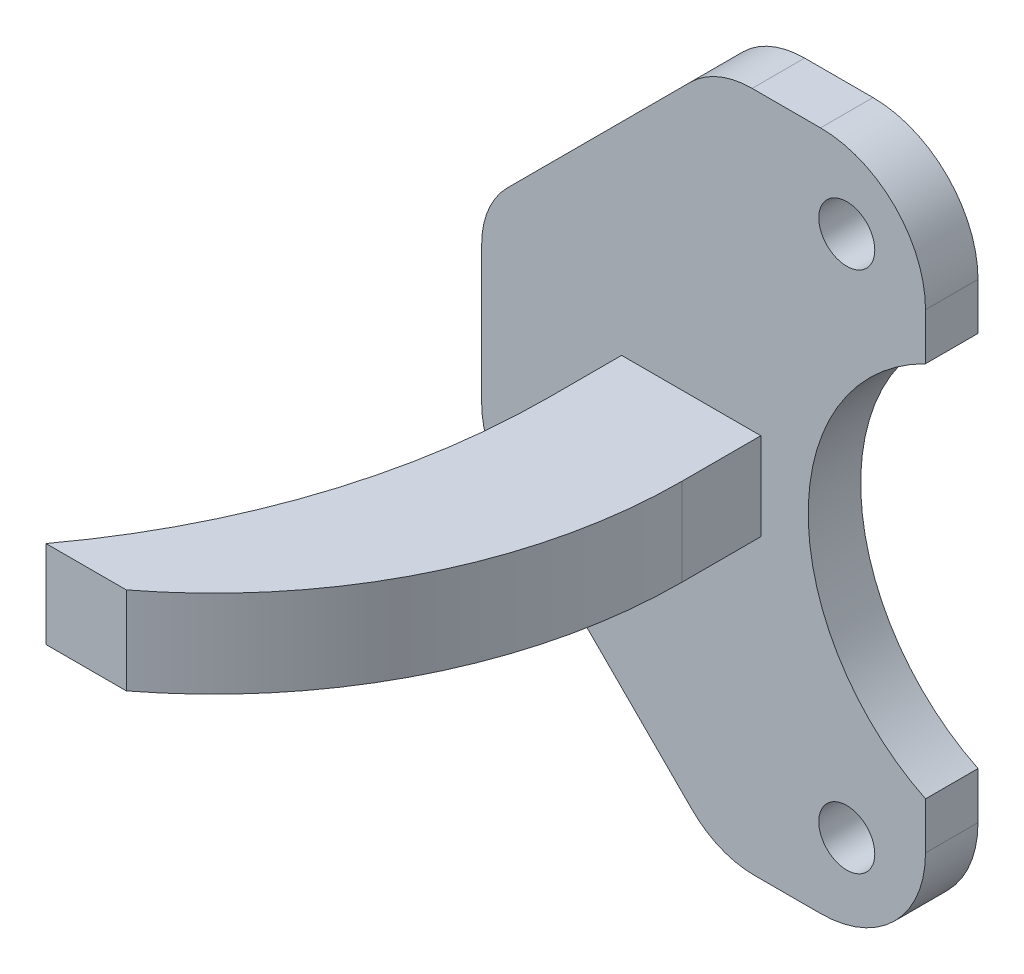
ISO-10303-21;
HEADER;
FILE_DESCRIPTION(('STEP AP214'),'2;1');
FILE_NAME('part.step','',(''),(''),'','','');
FILE_SCHEMA(('AUTOMOTIVE_DESIGN { 1 0 10303 214 1 1 1 1 }'));
ENDSEC;
DATA;
#1=APPLICATION_CONTEXT('core data for automotive mechanical design processes');
#2=APPLICATION_PROTOCOL_DEFINITION('international standard','automotive_design',2000,#1);
#3=PRODUCT_CONTEXT('',#1,'mechanical');
#4=PRODUCT('Part','Part','',(#3));
#5=PRODUCT_RELATED_PRODUCT_CATEGORY('part','',(#4));
#6=PRODUCT_DEFINITION_FORMATION('','',#4);
#7=PRODUCT_DEFINITION_CONTEXT('part definition',#1,'design');
#8=PRODUCT_DEFINITION('design','',#6,#7);
#9=PRODUCT_DEFINITION_SHAPE('','',#8);
#10=(LENGTH_UNIT() NAMED_UNIT(*) SI_UNIT(.MILLI.,.METRE.));
#11=(NAMED_UNIT(*) PLANE_ANGLE_UNIT() SI_UNIT($,.RADIAN.));
#12=(NAMED_UNIT(*) SI_UNIT($,.STERADIAN.) SOLID_ANGLE_UNIT());
#13=UNCERTAINTY_MEASURE_WITH_UNIT(LENGTH_MEASURE(1.E-05),#10,'distance_accuracy_value','');
#14=(GEOMETRIC_REPRESENTATION_CONTEXT(3) GLOBAL_UNCERTAINTY_ASSIGNED_CONTEXT((#13)) GLOBAL_UNIT_ASSIGNED_CONTEXT((#10,
#11,#12)) REPRESENTATION_CONTEXT('',''));
#15=CARTESIAN_POINT('',(0.,0.,0.));
#16=DIRECTION('',(0.,0.,1.));
#17=DIRECTION('',(1.,0.,0.));
#18=AXIS2_PLACEMENT_3D('',#15,#16,#17);
#19=CARTESIAN_POINT('',(35.5,-13.4440869692849,3.));
#20=DIRECTION('',(0.,0.,-1.));
#21=DIRECTION('',(-1.,0.,0.));
#22=AXIS2_PLACEMENT_3D('',#19,#20,#21);
#23=PLANE('',#22);
#24=CARTESIAN_POINT('',(37.,-14.9440869692848,3.));
#25=DIRECTION('',(0.,0.,1.));
#26=DIRECTION('',(1.,0.,0.));
#27=AXIS2_PLACEMENT_3D('',#24,#25,#26);
#28=CIRCLE('',#27,1.6);
#29=CARTESIAN_POINT('',(38.6,-14.9440869692848,3.));
#30=VERTEX_POINT('',#29);
#31=EDGE_CURVE('E291',#30,#30,#28,.T.);
#32=ORIENTED_EDGE('',*,*,#31,.F.);
#33=EDGE_LOOP('',(#32));
#34=FACE_BOUND('',#33,.T.);
#35=CARTESIAN_POINT('',(37.,14.9440869692848,3.));
#36=DIRECTION('',(0.,0.,1.));
#37=DIRECTION('',(1.,0.,0.));
#38=AXIS2_PLACEMENT_3D('',#35,#36,#37);
#39=CIRCLE('',#38,1.6);
#40=CARTESIAN_POINT('',(38.6,14.9440869692848,3.));
#41=VERTEX_POINT('',#40);
#42=EDGE_CURVE('E182',#41,#41,#39,.T.);
#43=ORIENTED_EDGE('',*,*,#42,.F.);
#44=EDGE_LOOP('',(#43));
#45=FACE_BOUND('',#44,.T.);
#46=CARTESIAN_POINT('',(35.5,-13.4440869692849,3.));
#47=DIRECTION('',(0.,0.,1.));
#48=DIRECTION('',(-1.,0.,0.));
#49=AXIS2_PLACEMENT_3D('',#46,#47,#48);
#50=CIRCLE('',#49,6.);
#51=CARTESIAN_POINT('',(35.5,-19.4440869692849,3.));
#52=VERTEX_POINT('',#51);
#53=CARTESIAN_POINT('',(41.5,-13.4440869692848,3.));
#54=VERTEX_POINT('',#53);
#55=EDGE_CURVE('E206',#52,#54,#50,.T.);
#56=ORIENTED_EDGE('',*,*,#55,.T.);
#57=DIRECTION('',(0.,1.,0.));
#58=VECTOR('',#57,1.);
#59=CARTESIAN_POINT('',(41.5,-10.7682017290115,3.));
#60=LINE('',#59,#58);
#61=CARTESIAN_POINT('',(41.5,-10.7682017290115,3.));
#62=VERTEX_POINT('',#61);
#63=EDGE_CURVE('E116',#54,#62,#60,.T.);
#64=ORIENTED_EDGE('',*,*,#63,.T.);
#65=CARTESIAN_POINT('',(46.7958315233127,0.,3.));
#66=DIRECTION('',(0.,0.,-1.));
#67=DIRECTION('',(1.,0.,0.));
#68=AXIS2_PLACEMENT_3D('',#65,#66,#67);
#69=CIRCLE('',#68,12.);
#70=CARTESIAN_POINT('',(41.5,10.7682017290116,3.));
#71=VERTEX_POINT('',#70);
#72=EDGE_CURVE('E239',#62,#71,#69,.T.);
#73=ORIENTED_EDGE('',*,*,#72,.T.);
#74=DIRECTION('',(0.,1.,0.));
#75=VECTOR('',#74,1.);
#76=CARTESIAN_POINT('',(41.5,13.4440869692848,3.));
#77=LINE('',#76,#75);
#78=CARTESIAN_POINT('',(41.5,13.4440869692848,3.));
#79=VERTEX_POINT('',#78);
#80=EDGE_CURVE('E258',#71,#79,#77,.T.);
#81=ORIENTED_EDGE('',*,*,#80,.T.);
#82=CARTESIAN_POINT('',(35.5,13.4440869692848,3.));
#83=DIRECTION('',(0.,0.,1.));
#84=DIRECTION('',(-1.,0.,0.));
#85=AXIS2_PLACEMENT_3D('',#82,#83,#84);
#86=CIRCLE('',#85,6.);
#87=CARTESIAN_POINT('',(35.5,19.4440869692848,3.));
#88=VERTEX_POINT('',#87);
#89=EDGE_CURVE('E255',#79,#88,#86,.T.);
#90=ORIENTED_EDGE('',*,*,#89,.T.);
#91=DIRECTION('',(-1.,0.,0.));
#92=VECTOR('',#91,1.);
#93=CARTESIAN_POINT('',(35.5,19.4440869692848,3.));
#94=LINE('',#93,#92);
#95=CARTESIAN_POINT('',(31.5921904216826,19.4440869692848,3.));
#96=VERTEX_POINT('',#95);
#97=EDGE_CURVE('E257',#88,#96,#94,.T.);
#98=ORIENTED_EDGE('',*,*,#97,.T.);
#99=CARTESIAN_POINT('',(31.5921904216826,14.4440869692848,3.));
#100=DIRECTION('',(0.,0.,1.));
#101=DIRECTION('',(-1.,0.,0.));
#102=AXIS2_PLACEMENT_3D('',#99,#100,#101);
#103=CIRCLE('',#102,5.);
#104=CARTESIAN_POINT('',(28.0566565157499,17.9796208752176,3.));
#105=VERTEX_POINT('',#104);
#106=EDGE_CURVE('E260',#96,#105,#103,.T.);
#107=ORIENTED_EDGE('',*,*,#106,.T.);
#108=DIRECTION('',(-0.707106781186546,-0.707106781186549,0.));
#109=VECTOR('',#108,1.);
#110=CARTESIAN_POINT('',(28.0566565157499,17.9796208752176,3.));
#111=LINE('',#110,#109);
#112=CARTESIAN_POINT('',(17.5972426377296,7.52020699719729,3.));
#113=VERTEX_POINT('',#112);
#114=EDGE_CURVE('E266',#105,#113,#111,.T.);
#115=ORIENTED_EDGE('',*,*,#114,.T.);
#116=CARTESIAN_POINT('',(21.1327765436624,3.98467309126455,3.));
#117=DIRECTION('',(0.,0.,1.));
#118=DIRECTION('',(1.,0.,0.));
#119=AXIS2_PLACEMENT_3D('',#116,#117,#118);
#120=CIRCLE('',#119,5.);
#121=CARTESIAN_POINT('',(16.1327765436624,3.98467309126456,3.));
#122=VERTEX_POINT('',#121);
#123=EDGE_CURVE('E268',#113,#122,#120,.T.);
#124=ORIENTED_EDGE('',*,*,#123,.T.);
#125=DIRECTION('',(0.,-1.,0.));
#126=VECTOR('',#125,1.);
#127=CARTESIAN_POINT('',(16.1327765436624,3.98467309126456,3.));
#128=LINE('',#127,#126);
#129=CARTESIAN_POINT('',(16.1327765436624,-3.87319128500447,3.));
#130=VERTEX_POINT('',#129);
#131=EDGE_CURVE('E270',#122,#130,#128,.T.);
#132=ORIENTED_EDGE('',*,*,#131,.T.);
#133=CARTESIAN_POINT('',(21.1327765436624,-3.87319128500449,3.));
#134=DIRECTION('',(0.,0.,1.));
#135=DIRECTION('',(1.,0.,0.));
#136=AXIS2_PLACEMENT_3D('',#133,#134,#135);
#137=CIRCLE('',#136,5.);
#138=CARTESIAN_POINT('',(17.5972426377296,-7.40872519093724,3.));
#139=VERTEX_POINT('',#138);
#140=EDGE_CURVE('E157',#130,#139,#137,.T.);
#141=ORIENTED_EDGE('',*,*,#140,.T.);
#142=DIRECTION('',(0.707106781186552,-0.707106781186544,0.));
#143=VECTOR('',#142,1.);
#144=CARTESIAN_POINT('',(17.5972426377296,-7.40872519093724,3.));
#145=LINE('',#144,#143);
#146=CARTESIAN_POINT('',(28.1681383220101,-17.9796208752176,3.));
#147=VERTEX_POINT('',#146);
#148=EDGE_CURVE('E150',#139,#147,#145,.T.);
#149=ORIENTED_EDGE('',*,*,#148,.T.);
#150=CARTESIAN_POINT('',(31.7036722279428,-14.4440869692849,3.));
#151=DIRECTION('',(0.,0.,1.));
#152=DIRECTION('',(1.,0.,0.));
#153=AXIS2_PLACEMENT_3D('',#150,#151,#152);
#154=CIRCLE('',#153,5.);
#155=CARTESIAN_POINT('',(31.7036722279428,-19.4440869692848,3.));
#156=VERTEX_POINT('',#155);
#157=EDGE_CURVE('E154',#147,#156,#154,.T.);
#158=ORIENTED_EDGE('',*,*,#157,.T.);
#159=DIRECTION('',(1.,0.,0.));
#160=VECTOR('',#159,1.);
#161=CARTESIAN_POINT('',(35.5,-19.4440869692849,3.));
#162=LINE('',#161,#160);
#163=EDGE_CURVE('E57',#156,#52,#162,.T.);
#164=ORIENTED_EDGE('',*,*,#163,.T.);
#165=EDGE_LOOP('',(#56,#64,#73,#81,#90,#98,#107,#115,#124,#132,#141,#149,#158,#164));
#166=FACE_BOUND('',#165,.T.);
#167=DIRECTION('',(-1.,0.,0.));
#168=VECTOR('',#167,1.);
#169=CARTESIAN_POINT('',(24.1327765436624,2.5,3.));
#170=LINE('',#169,#168);
#171=CARTESIAN_POINT('',(32.0857556598747,2.5,3.));
#172=VERTEX_POINT('',#171);
#173=CARTESIAN_POINT('',(24.1327765436624,2.5,3.));
#174=VERTEX_POINT('',#173);
#175=EDGE_CURVE('E319',#172,#174,#170,.T.);
#176=ORIENTED_EDGE('',*,*,#175,.F.);
#177=DIRECTION('',(0.,-1.,0.));
#178=VECTOR('',#177,1.);
#179=CARTESIAN_POINT('',(32.0857556598747,2.5,3.));
#180=LINE('',#179,#178);
#181=CARTESIAN_POINT('',(32.0857556598747,-2.5,3.));
#182=VERTEX_POINT('',#181);
#183=EDGE_CURVE('E312',#172,#182,#180,.T.);
#184=ORIENTED_EDGE('',*,*,#183,.T.);
#185=DIRECTION('',(-1.,0.,0.));
#186=VECTOR('',#185,1.);
#187=CARTESIAN_POINT('',(24.1327765436624,-2.5,3.));
#188=LINE('',#187,#186);
#189=CARTESIAN_POINT('',(24.1327765436624,-2.5,3.));
#190=VERTEX_POINT('',#189);
#191=EDGE_CURVE('E331',#182,#190,#188,.T.);
#192=ORIENTED_EDGE('',*,*,#191,.T.);
#193=DIRECTION('',(0.,-1.,0.));
#194=VECTOR('',#193,1.);
#195=CARTESIAN_POINT('',(24.1327765436624,2.5,3.));
#196=LINE('',#195,#194);
#197=EDGE_CURVE('E48',#174,#190,#196,.T.);
#198=ORIENTED_EDGE('',*,*,#197,.F.);
#199=EDGE_LOOP('',(#176,#184,#192,#198));
#200=FACE_BOUND('',#199,.T.);
#201=ADVANCED_FACE('F33',(#34,#45,#166,#200),#23,.F.);
#202=CARTESIAN_POINT('',(35.5,-13.4440869692849,0.));
#203=DIRECTION('',(0.,0.,-1.));
#204=DIRECTION('',(-1.,0.,0.));
#205=AXIS2_PLACEMENT_3D('',#202,#203,#204);
#206=PLANE('',#205);
#207=CARTESIAN_POINT('',(37.,14.9440869692848,0.));
#208=DIRECTION('',(0.,0.,1.));
#209=DIRECTION('',(1.,0.,0.));
#210=AXIS2_PLACEMENT_3D('',#207,#208,#209);
#211=CIRCLE('',#210,1.6);
#212=CARTESIAN_POINT('',(38.6,14.9440869692848,0.));
#213=VERTEX_POINT('',#212);
#214=EDGE_CURVE('E288',#213,#213,#211,.T.);
#215=ORIENTED_EDGE('',*,*,#214,.T.);
#216=EDGE_LOOP('',(#215));
#217=FACE_BOUND('',#216,.T.);
#218=CARTESIAN_POINT('',(35.5,-13.4440869692849,0.));
#219=DIRECTION('',(0.,0.,1.));
#220=DIRECTION('',(-1.,0.,0.));
#221=AXIS2_PLACEMENT_3D('',#218,#219,#220);
#222=CIRCLE('',#221,6.);
#223=CARTESIAN_POINT('',(35.5,-19.4440869692849,0.));
#224=VERTEX_POINT('',#223);
#225=CARTESIAN_POINT('',(41.5,-13.4440869692848,0.));
#226=VERTEX_POINT('',#225);
#227=EDGE_CURVE('E178',#224,#226,#222,.T.);
#228=ORIENTED_EDGE('',*,*,#227,.F.);
#229=DIRECTION('',(1.,0.,0.));
#230=VECTOR('',#229,1.);
#231=CARTESIAN_POINT('',(35.5,-19.4440869692849,0.));
#232=LINE('',#231,#230);
#233=CARTESIAN_POINT('',(31.7036722279428,-19.4440869692848,0.));
#234=VERTEX_POINT('',#233);
#235=EDGE_CURVE('E108',#234,#224,#232,.T.);
#236=ORIENTED_EDGE('',*,*,#235,.F.);
#237=CARTESIAN_POINT('',(31.7036722279428,-14.4440869692849,0.));
#238=DIRECTION('',(0.,0.,1.));
#239=DIRECTION('',(1.,0.,0.));
#240=AXIS2_PLACEMENT_3D('',#237,#238,#239);
#241=CIRCLE('',#240,5.);
#242=CARTESIAN_POINT('',(28.1681383220101,-17.9796208752176,0.));
#243=VERTEX_POINT('',#242);
#244=EDGE_CURVE('E203',#243,#234,#241,.T.);
#245=ORIENTED_EDGE('',*,*,#244,.F.);
#246=DIRECTION('',(0.707106781186552,-0.707106781186544,0.));
#247=VECTOR('',#246,1.);
#248=CARTESIAN_POINT('',(17.5972426377296,-7.40872519093724,0.));
#249=LINE('',#248,#247);
#250=CARTESIAN_POINT('',(17.5972426377296,-7.40872519093724,0.));
#251=VERTEX_POINT('',#250);
#252=EDGE_CURVE('E166',#251,#243,#249,.T.);
#253=ORIENTED_EDGE('',*,*,#252,.F.);
#254=CARTESIAN_POINT('',(21.1327765436624,-3.87319128500449,0.));
#255=DIRECTION('',(0.,0.,1.));
#256=DIRECTION('',(1.,0.,0.));
#257=AXIS2_PLACEMENT_3D('',#254,#255,#256);
#258=CIRCLE('',#257,5.);
#259=CARTESIAN_POINT('',(16.1327765436624,-3.87319128500447,0.));
#260=VERTEX_POINT('',#259);
#261=EDGE_CURVE('E200',#260,#251,#258,.T.);
#262=ORIENTED_EDGE('',*,*,#261,.F.);
#263=DIRECTION('',(0.,-1.,0.));
#264=VECTOR('',#263,1.);
#265=CARTESIAN_POINT('',(16.1327765436624,3.98467309126456,0.));
#266=LINE('',#265,#264);
#267=CARTESIAN_POINT('',(16.1327765436624,3.98467309126456,0.));
#268=VERTEX_POINT('',#267);
#269=EDGE_CURVE('E198',#268,#260,#266,.T.);
#270=ORIENTED_EDGE('',*,*,#269,.F.);
#271=CARTESIAN_POINT('',(21.1327765436624,3.98467309126455,0.));
#272=DIRECTION('',(0.,0.,1.));
#273=DIRECTION('',(1.,0.,0.));
#274=AXIS2_PLACEMENT_3D('',#271,#272,#273);
#275=CIRCLE('',#274,5.);
#276=CARTESIAN_POINT('',(17.5972426377296,7.52020699719729,0.));
#277=VERTEX_POINT('',#276);
#278=EDGE_CURVE('E196',#277,#268,#275,.T.);
#279=ORIENTED_EDGE('',*,*,#278,.F.);
#280=DIRECTION('',(-0.707106781186546,-0.707106781186549,0.));
#281=VECTOR('',#280,1.);
#282=CARTESIAN_POINT('',(28.0566565157499,17.9796208752176,0.));
#283=LINE('',#282,#281);
#284=CARTESIAN_POINT('',(28.0566565157499,17.9796208752176,0.));
#285=VERTEX_POINT('',#284);
#286=EDGE_CURVE('E194',#285,#277,#283,.T.);
#287=ORIENTED_EDGE('',*,*,#286,.F.);
#288=CARTESIAN_POINT('',(31.5921904216826,14.4440869692848,0.));
#289=DIRECTION('',(0.,0.,1.));
#290=DIRECTION('',(-1.,0.,0.));
#291=AXIS2_PLACEMENT_3D('',#288,#289,#290);
#292=CIRCLE('',#291,5.);
#293=CARTESIAN_POINT('',(31.5921904216826,19.4440869692848,0.));
#294=VERTEX_POINT('',#293);
#295=EDGE_CURVE('E192',#294,#285,#292,.T.);
#296=ORIENTED_EDGE('',*,*,#295,.F.);
#297=DIRECTION('',(-1.,0.,0.));
#298=VECTOR('',#297,1.);
#299=CARTESIAN_POINT('',(35.5,19.4440869692848,0.));
#300=LINE('',#299,#298);
#301=CARTESIAN_POINT('',(35.5,19.4440869692848,0.));
#302=VERTEX_POINT('',#301);
#303=EDGE_CURVE('E190',#302,#294,#300,.T.);
#304=ORIENTED_EDGE('',*,*,#303,.F.);
#305=CARTESIAN_POINT('',(35.5,13.4440869692848,0.));
#306=DIRECTION('',(0.,0.,1.));
#307=DIRECTION('',(-1.,0.,0.));
#308=AXIS2_PLACEMENT_3D('',#305,#306,#307);
#309=CIRCLE('',#308,6.);
#310=CARTESIAN_POINT('',(41.5,13.4440869692848,0.));
#311=VERTEX_POINT('',#310);
#312=EDGE_CURVE('E188',#311,#302,#309,.T.);
#313=ORIENTED_EDGE('',*,*,#312,.F.);
#314=DIRECTION('',(0.,1.,0.));
#315=VECTOR('',#314,1.);
#316=CARTESIAN_POINT('',(41.5,13.4440869692848,0.));
#317=LINE('',#316,#315);
#318=CARTESIAN_POINT('',(41.5,10.7682017290116,0.));
#319=VERTEX_POINT('',#318);
#320=EDGE_CURVE('E186',#319,#311,#317,.T.);
#321=ORIENTED_EDGE('',*,*,#320,.F.);
#322=CARTESIAN_POINT('',(46.7958315233127,0.,0.));
#323=DIRECTION('',(0.,0.,-1.));
#324=DIRECTION('',(1.,0.,0.));
#325=AXIS2_PLACEMENT_3D('',#322,#323,#324);
#326=CIRCLE('',#325,12.);
#327=CARTESIAN_POINT('',(41.5,-10.7682017290115,0.));
#328=VERTEX_POINT('',#327);
#329=EDGE_CURVE('E184',#328,#319,#326,.T.);
#330=ORIENTED_EDGE('',*,*,#329,.F.);
#331=DIRECTION('',(0.,1.,0.));
#332=VECTOR('',#331,1.);
#333=CARTESIAN_POINT('',(41.5,-10.7682017290115,0.));
#334=LINE('',#333,#332);
#335=EDGE_CURVE('E181',#226,#328,#334,.T.);
#336=ORIENTED_EDGE('',*,*,#335,.F.);
#337=EDGE_LOOP('',(#228,#236,#245,#253,#262,#270,#279,#287,#296,#304,#313,#321,#330,#336));
#338=FACE_BOUND('',#337,.T.);
#339=CARTESIAN_POINT('',(37.,-14.9440869692848,0.));
#340=DIRECTION('',(0.,0.,1.));
#341=DIRECTION('',(1.,0.,0.));
#342=AXIS2_PLACEMENT_3D('',#339,#340,#341);
#343=CIRCLE('',#342,1.6);
#344=CARTESIAN_POINT('',(38.6,-14.9440869692848,0.));
#345=VERTEX_POINT('',#344);
#346=EDGE_CURVE('E294',#345,#345,#343,.T.);
#347=ORIENTED_EDGE('',*,*,#346,.T.);
#348=EDGE_LOOP('',(#347));
#349=FACE_BOUND('',#348,.T.);
#350=ADVANCED_FACE('F243',(#217,#338,#349),#206,.T.);
#351=CARTESIAN_POINT('',(35.5,-13.4440869692849,3.));
#352=DIRECTION('',(0.,0.,-1.));
#353=DIRECTION('',(-1.,0.,0.));
#354=AXIS2_PLACEMENT_3D('',#351,#352,#353);
#355=CYLINDRICAL_SURFACE('',#354,6.);
#356=ORIENTED_EDGE('',*,*,#227,.T.);
#357=DIRECTION('',(0.,0.,-1.));
#358=VECTOR('',#357,1.);
#359=CARTESIAN_POINT('',(41.5,-13.4440869692848,3.));
#360=LINE('',#359,#358);
#361=EDGE_CURVE('E11',#54,#226,#360,.T.);
#362=ORIENTED_EDGE('',*,*,#361,.F.);
#363=ORIENTED_EDGE('',*,*,#55,.F.);
#364=DIRECTION('',(0.,0.,-1.));
#365=VECTOR('',#364,1.);
#366=CARTESIAN_POINT('',(35.5,-19.4440869692849,3.));
#367=LINE('',#366,#365);
#368=EDGE_CURVE('E174',#52,#224,#367,.T.);
#369=ORIENTED_EDGE('',*,*,#368,.T.);
#370=EDGE_LOOP('',(#356,#362,#363,#369));
#371=FACE_BOUND('',#370,.T.);
#372=ADVANCED_FACE('F35',(#371),#355,.T.);
#373=CARTESIAN_POINT('',(41.5,-10.7682017290115,3.));
#374=DIRECTION('',(-1.,0.,0.));
#375=DIRECTION('',(0.,0.,1.));
#376=AXIS2_PLACEMENT_3D('',#373,#374,#375);
#377=PLANE('',#376);
#378=ORIENTED_EDGE('',*,*,#335,.T.);
#379=DIRECTION('',(0.,0.,-1.));
#380=VECTOR('',#379,1.);
#381=CARTESIAN_POINT('',(41.5,-10.7682017290115,3.));
#382=LINE('',#381,#380);
#383=EDGE_CURVE('E41',#62,#328,#382,.T.);
#384=ORIENTED_EDGE('',*,*,#383,.F.);
#385=ORIENTED_EDGE('',*,*,#63,.F.);
#386=ORIENTED_EDGE('',*,*,#361,.T.);
#387=EDGE_LOOP('',(#378,#384,#385,#386));
#388=FACE_BOUND('',#387,.T.);
#389=ADVANCED_FACE('F448',(#388),#377,.F.);
#390=CARTESIAN_POINT('',(46.7958315233127,0.,3.));
#391=DIRECTION('',(0.,0.,-1.));
#392=DIRECTION('',(-1.,0.,0.));
#393=AXIS2_PLACEMENT_3D('',#390,#391,#392);
#394=CYLINDRICAL_SURFACE('',#393,12.);
#395=ORIENTED_EDGE('',*,*,#329,.T.);
#396=DIRECTION('',(0.,0.,-1.));
#397=VECTOR('',#396,1.);
#398=CARTESIAN_POINT('',(41.5,10.7682017290116,3.));
#399=LINE('',#398,#397);
#400=EDGE_CURVE('E231',#71,#319,#399,.T.);
#401=ORIENTED_EDGE('',*,*,#400,.F.);
#402=ORIENTED_EDGE('',*,*,#72,.F.);
#403=ORIENTED_EDGE('',*,*,#383,.T.);
#404=EDGE_LOOP('',(#395,#401,#402,#403));
#405=FACE_BOUND('',#404,.T.);
#406=ADVANCED_FACE('F237',(#405),#394,.F.);
#407=CARTESIAN_POINT('',(41.5,13.4440869692848,3.));
#408=DIRECTION('',(-1.,0.,0.));
#409=DIRECTION('',(0.,0.,1.));
#410=AXIS2_PLACEMENT_3D('',#407,#408,#409);
#411=PLANE('',#410);
#412=ORIENTED_EDGE('',*,*,#320,.T.);
#413=DIRECTION('',(0.,0.,-1.));
#414=VECTOR('',#413,1.);
#415=CARTESIAN_POINT('',(41.5,13.4440869692848,3.));
#416=LINE('',#415,#414);
#417=EDGE_CURVE('E228',#79,#311,#416,.T.);
#418=ORIENTED_EDGE('',*,*,#417,.F.);
#419=ORIENTED_EDGE('',*,*,#80,.F.);
#420=ORIENTED_EDGE('',*,*,#400,.T.);
#421=EDGE_LOOP('',(#412,#418,#419,#420));
#422=FACE_BOUND('',#421,.T.);
#423=ADVANCED_FACE('F249',(#422),#411,.F.);
#424=CARTESIAN_POINT('',(35.5,13.4440869692848,3.));
#425=DIRECTION('',(0.,0.,-1.));
#426=DIRECTION('',(-1.,0.,0.));
#427=AXIS2_PLACEMENT_3D('',#424,#425,#426);
#428=CYLINDRICAL_SURFACE('',#427,6.);
#429=ORIENTED_EDGE('',*,*,#312,.T.);
#430=DIRECTION('',(0.,0.,-1.));
#431=VECTOR('',#430,1.);
#432=CARTESIAN_POINT('',(35.5,19.4440869692848,3.));
#433=LINE('',#432,#431);
#434=EDGE_CURVE('E225',#88,#302,#433,.T.);
#435=ORIENTED_EDGE('',*,*,#434,.F.);
#436=ORIENTED_EDGE('',*,*,#89,.F.);
#437=ORIENTED_EDGE('',*,*,#417,.T.);
#438=EDGE_LOOP('',(#429,#435,#436,#437));
#439=FACE_BOUND('',#438,.T.);
#440=ADVANCED_FACE('F253',(#439),#428,.T.);
#441=CARTESIAN_POINT('',(35.5,19.4440869692848,3.));
#442=DIRECTION('',(0.,-1.,0.));
#443=DIRECTION('',(1.,0.,0.));
#444=AXIS2_PLACEMENT_3D('',#441,#442,#443);
#445=PLANE('',#444);
#446=ORIENTED_EDGE('',*,*,#303,.T.);
#447=DIRECTION('',(0.,0.,-1.));
#448=VECTOR('',#447,1.);
#449=CARTESIAN_POINT('',(31.5921904216826,19.4440869692848,3.));
#450=LINE('',#449,#448);
#451=EDGE_CURVE('E222',#96,#294,#450,.T.);
#452=ORIENTED_EDGE('',*,*,#451,.F.);
#453=ORIENTED_EDGE('',*,*,#97,.F.);
#454=ORIENTED_EDGE('',*,*,#434,.T.);
#455=EDGE_LOOP('',(#446,#452,#453,#454));
#456=FACE_BOUND('',#455,.T.);
#457=ADVANCED_FACE('F438',(#456),#445,.F.);
#458=CARTESIAN_POINT('',(31.5921904216826,14.4440869692848,3.));
#459=DIRECTION('',(0.,0.,-1.));
#460=DIRECTION('',(-1.,0.,0.));
#461=AXIS2_PLACEMENT_3D('',#458,#459,#460);
#462=CYLINDRICAL_SURFACE('',#461,5.);
#463=ORIENTED_EDGE('',*,*,#295,.T.);
#464=DIRECTION('',(0.,0.,-1.));
#465=VECTOR('',#464,1.);
#466=CARTESIAN_POINT('',(28.0566565157499,17.9796208752176,3.));
#467=LINE('',#466,#465);
#468=EDGE_CURVE('E219',#105,#285,#467,.T.);
#469=ORIENTED_EDGE('',*,*,#468,.F.);
#470=ORIENTED_EDGE('',*,*,#106,.F.);
#471=ORIENTED_EDGE('',*,*,#451,.T.);
#472=EDGE_LOOP('',(#463,#469,#470,#471));
#473=FACE_BOUND('',#472,.T.);
#474=ADVANCED_FACE('F434',(#473),#462,.T.);
#475=CARTESIAN_POINT('',(28.0566565157499,17.9796208752176,3.));
#476=DIRECTION('',(0.707106781186549,-0.707106781186546,0.));
#477=DIRECTION('',(0.707106781186546,0.707106781186549,0.));
#478=AXIS2_PLACEMENT_3D('',#475,#476,#477);
#479=PLANE('',#478);
#480=ORIENTED_EDGE('',*,*,#286,.T.);
#481=DIRECTION('',(0.,0.,-1.));
#482=VECTOR('',#481,1.);
#483=CARTESIAN_POINT('',(17.5972426377296,7.52020699719729,3.));
#484=LINE('',#483,#482);
#485=EDGE_CURVE('E216',#113,#277,#484,.T.);
#486=ORIENTED_EDGE('',*,*,#485,.F.);
#487=ORIENTED_EDGE('',*,*,#114,.F.);
#488=ORIENTED_EDGE('',*,*,#468,.T.);
#489=EDGE_LOOP('',(#480,#486,#487,#488));
#490=FACE_BOUND('',#489,.T.);
#491=ADVANCED_FACE('F430',(#490),#479,.F.);
#492=CARTESIAN_POINT('',(21.1327765436624,3.98467309126455,3.));
#493=DIRECTION('',(0.,0.,-1.));
#494=DIRECTION('',(-1.,0.,0.));
#495=AXIS2_PLACEMENT_3D('',#492,#493,#494);
#496=CYLINDRICAL_SURFACE('',#495,5.);
#497=ORIENTED_EDGE('',*,*,#278,.T.);
#498=DIRECTION('',(0.,0.,-1.));
#499=VECTOR('',#498,1.);
#500=CARTESIAN_POINT('',(16.1327765436624,3.98467309126456,3.));
#501=LINE('',#500,#499);
#502=EDGE_CURVE('E213',#122,#268,#501,.T.);
#503=ORIENTED_EDGE('',*,*,#502,.F.);
#504=ORIENTED_EDGE('',*,*,#123,.F.);
#505=ORIENTED_EDGE('',*,*,#485,.T.);
#506=EDGE_LOOP('',(#497,#503,#504,#505));
#507=FACE_BOUND('',#506,.T.);
#508=ADVANCED_FACE('F427',(#507),#496,.T.);
#509=CARTESIAN_POINT('',(16.1327765436624,3.98467309126456,3.));
#510=DIRECTION('',(1.,0.,0.));
#511=DIRECTION('',(0.,0.,-1.));
#512=AXIS2_PLACEMENT_3D('',#509,#510,#511);
#513=PLANE('',#512);
#514=ORIENTED_EDGE('',*,*,#269,.T.);
#515=DIRECTION('',(0.,0.,-1.));
#516=VECTOR('',#515,1.);
#517=CARTESIAN_POINT('',(16.1327765436624,-3.87319128500447,3.));
#518=LINE('',#517,#516);
#519=EDGE_CURVE('E210',#130,#260,#518,.T.);
#520=ORIENTED_EDGE('',*,*,#519,.F.);
#521=ORIENTED_EDGE('',*,*,#131,.F.);
#522=ORIENTED_EDGE('',*,*,#502,.T.);
#523=EDGE_LOOP('',(#514,#520,#521,#522));
#524=FACE_BOUND('',#523,.T.);
#525=ADVANCED_FACE('F276',(#524),#513,.F.);
#526=CARTESIAN_POINT('',(21.1327765436624,-3.87319128500449,3.));
#527=DIRECTION('',(0.,0.,-1.));
#528=DIRECTION('',(-1.,0.,0.));
#529=AXIS2_PLACEMENT_3D('',#526,#527,#528);
#530=CYLINDRICAL_SURFACE('',#529,5.);
#531=ORIENTED_EDGE('',*,*,#261,.T.);
#532=DIRECTION('',(0.,0.,-1.));
#533=VECTOR('',#532,1.);
#534=CARTESIAN_POINT('',(17.5972426377296,-7.40872519093724,3.));
#535=LINE('',#534,#533);
#536=EDGE_CURVE('E169',#139,#251,#535,.T.);
#537=ORIENTED_EDGE('',*,*,#536,.F.);
#538=ORIENTED_EDGE('',*,*,#140,.F.);
#539=ORIENTED_EDGE('',*,*,#519,.T.);
#540=EDGE_LOOP('',(#531,#537,#538,#539));
#541=FACE_BOUND('',#540,.T.);
#542=ADVANCED_FACE('F280',(#541),#530,.T.);
#543=CARTESIAN_POINT('',(17.5972426377296,-7.40872519093724,3.));
#544=DIRECTION('',(0.707106781186544,0.707106781186551,0.));
#545=DIRECTION('',(-0.707106781186551,0.707106781186544,0.));
#546=AXIS2_PLACEMENT_3D('',#543,#544,#545);
#547=PLANE('',#546);
#548=ORIENTED_EDGE('',*,*,#252,.T.);
#549=DIRECTION('',(0.,0.,-1.));
#550=VECTOR('',#549,1.);
#551=CARTESIAN_POINT('',(28.1681383220101,-17.9796208752176,3.));
#552=LINE('',#551,#550);
#553=EDGE_CURVE('E163',#147,#243,#552,.T.);
#554=ORIENTED_EDGE('',*,*,#553,.F.);
#555=ORIENTED_EDGE('',*,*,#148,.F.);
#556=ORIENTED_EDGE('',*,*,#536,.T.);
#557=EDGE_LOOP('',(#548,#554,#555,#556));
#558=FACE_BOUND('',#557,.T.);
#559=ADVANCED_FACE('F164',(#558),#547,.F.);
#560=CARTESIAN_POINT('',(31.7036722279428,-14.4440869692849,3.));
#561=DIRECTION('',(0.,0.,-1.));
#562=DIRECTION('',(-1.,0.,0.));
#563=AXIS2_PLACEMENT_3D('',#560,#561,#562);
#564=CYLINDRICAL_SURFACE('',#563,5.);
#565=ORIENTED_EDGE('',*,*,#244,.T.);
#566=DIRECTION('',(0.,0.,-1.));
#567=VECTOR('',#566,1.);
#568=CARTESIAN_POINT('',(31.7036722279428,-19.4440869692848,3.));
#569=LINE('',#568,#567);
#570=EDGE_CURVE('E170',#156,#234,#569,.T.);
#571=ORIENTED_EDGE('',*,*,#570,.F.);
#572=ORIENTED_EDGE('',*,*,#157,.F.);
#573=ORIENTED_EDGE('',*,*,#553,.T.);
#574=EDGE_LOOP('',(#565,#571,#572,#573));
#575=FACE_BOUND('',#574,.T.);
#576=ADVANCED_FACE('F172',(#575),#564,.T.);
#577=CARTESIAN_POINT('',(35.5,-19.4440869692849,3.));
#578=DIRECTION('',(0.,1.,0.));
#579=DIRECTION('',(-1.,0.,0.));
#580=AXIS2_PLACEMENT_3D('',#577,#578,#579);
#581=PLANE('',#580);
#582=ORIENTED_EDGE('',*,*,#235,.T.);
#583=ORIENTED_EDGE('',*,*,#368,.F.);
#584=ORIENTED_EDGE('',*,*,#163,.F.);
#585=ORIENTED_EDGE('',*,*,#570,.T.);
#586=EDGE_LOOP('',(#582,#583,#584,#585));
#587=FACE_BOUND('',#586,.T.);
#588=ADVANCED_FACE('F281',(#587),#581,.F.);
#589=CARTESIAN_POINT('',(37.,14.9440869692848,3.));
#590=DIRECTION('',(0.,0.,-1.));
#591=DIRECTION('',(-1.,0.,0.));
#592=AXIS2_PLACEMENT_3D('',#589,#590,#591);
#593=CYLINDRICAL_SURFACE('',#592,1.6);
#594=ORIENTED_EDGE('',*,*,#42,.T.);
#595=EDGE_LOOP('',(#594));
#596=FACE_BOUND('',#595,.T.);
#597=ORIENTED_EDGE('',*,*,#214,.F.);
#598=EDGE_LOOP('',(#597));
#599=FACE_BOUND('',#598,.T.);
#600=ADVANCED_FACE('F414',(#596,#599),#593,.F.);
#601=CARTESIAN_POINT('',(37.,-14.9440869692848,3.));
#602=DIRECTION('',(0.,0.,-1.));
#603=DIRECTION('',(-1.,0.,0.));
#604=AXIS2_PLACEMENT_3D('',#601,#602,#603);
#605=CYLINDRICAL_SURFACE('',#604,1.6);
#606=ORIENTED_EDGE('',*,*,#31,.T.);
#607=EDGE_LOOP('',(#606));
#608=FACE_BOUND('',#607,.T.);
#609=ORIENTED_EDGE('',*,*,#346,.F.);
#610=EDGE_LOOP('',(#609));
#611=FACE_BOUND('',#610,.T.);
#612=ADVANCED_FACE('F535',(#608,#611),#605,.F.);
#613=CARTESIAN_POINT('',(24.1327765436624,2.5,3.));
#614=DIRECTION('',(1.,0.,0.));
#615=DIRECTION('',(0.,0.,-1.));
#616=AXIS2_PLACEMENT_3D('',#613,#614,#615);
#617=PLANE('',#616);
#618=DIRECTION('',(0.,0.,1.));
#619=VECTOR('',#618,1.);
#620=CARTESIAN_POINT('',(24.1327765436624,-2.5,3.));
#621=LINE('',#620,#619);
#622=CARTESIAN_POINT('',(24.1327765436624,-2.5,7.13280961628341));
#623=VERTEX_POINT('',#622);
#624=EDGE_CURVE('E329',#190,#623,#621,.T.);
#625=ORIENTED_EDGE('',*,*,#624,.T.);
#626=DIRECTION('',(0.,-1.,0.));
#627=VECTOR('',#626,1.);
#628=CARTESIAN_POINT('',(24.1327765436624,2.5,7.13280961628341));
#629=LINE('',#628,#627);
#630=CARTESIAN_POINT('',(24.1327765436624,2.5,7.13280961628341));
#631=VERTEX_POINT('',#630);
#632=EDGE_CURVE('E300',#631,#623,#629,.T.);
#633=ORIENTED_EDGE('',*,*,#632,.F.);
#634=DIRECTION('',(0.,0.,1.));
#635=VECTOR('',#634,1.);
#636=CARTESIAN_POINT('',(24.1327765436624,2.5,3.));
#637=LINE('',#636,#635);
#638=EDGE_CURVE('E345',#174,#631,#637,.T.);
#639=ORIENTED_EDGE('',*,*,#638,.F.);
#640=ORIENTED_EDGE('',*,*,#197,.T.);
#641=EDGE_LOOP('',(#625,#633,#639,#640));
#642=FACE_BOUND('',#641,.T.);
#643=ADVANCED_FACE('F543',(#642),#617,.F.);
#644=CARTESIAN_POINT('',(-12.2186685726463,2.5,7.13280961628341));
#645=DIRECTION('',(0.,-1.,0.));
#646=DIRECTION('',(0.,0.,-1.));
#647=AXIS2_PLACEMENT_3D('',#644,#645,#646);
#648=CYLINDRICAL_SURFACE('',#647,36.3514451163087);
#649=CARTESIAN_POINT('',(-12.2186685726463,-2.5,7.13280961628341));
#650=DIRECTION('',(0.,-1.,0.));
#651=DIRECTION('',(0.,0.,-1.));
#652=AXIS2_PLACEMENT_3D('',#649,#650,#651);
#653=CIRCLE('',#652,36.3514451163087);
#654=CARTESIAN_POINT('',(16.9968442855158,-2.5,28.7633752695104));
#655=VERTEX_POINT('',#654);
#656=EDGE_CURVE('E326',#623,#655,#653,.T.);
#657=ORIENTED_EDGE('',*,*,#656,.T.);
#658=DIRECTION('',(0.,-1.,0.));
#659=VECTOR('',#658,1.);
#660=CARTESIAN_POINT('',(16.9968442855158,2.5,28.7633752695104));
#661=LINE('',#660,#659);
#662=CARTESIAN_POINT('',(16.9968442855158,2.5,28.7633752695104));
#663=VERTEX_POINT('',#662);
#664=EDGE_CURVE('E303',#663,#655,#661,.T.);
#665=ORIENTED_EDGE('',*,*,#664,.F.);
#666=CARTESIAN_POINT('',(-12.2186685726463,2.5,7.13280961628341));
#667=DIRECTION('',(0.,-1.,0.));
#668=DIRECTION('',(0.,0.,-1.));
#669=AXIS2_PLACEMENT_3D('',#666,#667,#668);
#670=CIRCLE('',#669,36.3514451163087);
#671=EDGE_CURVE('E342',#631,#663,#670,.T.);
#672=ORIENTED_EDGE('',*,*,#671,.F.);
#673=ORIENTED_EDGE('',*,*,#632,.T.);
#674=EDGE_LOOP('',(#657,#665,#672,#673));
#675=FACE_BOUND('',#674,.T.);
#676=ADVANCED_FACE('F387',(#675),#648,.F.);
#677=CARTESIAN_POINT('',(21.584586926695,2.5,28.7633752695104));
#678=DIRECTION('',(0.,0.,-1.));
#679=DIRECTION('',(-1.,0.,0.));
#680=AXIS2_PLACEMENT_3D('',#677,#678,#679);
#681=PLANE('',#680);
#682=DIRECTION('',(1.,0.,0.));
#683=VECTOR('',#682,1.);
#684=CARTESIAN_POINT('',(21.584586926695,-2.5,28.7633752695104));
#685=LINE('',#684,#683);
#686=CARTESIAN_POINT('',(21.5845869266949,-2.5,28.7633752695104));
#687=VERTEX_POINT('',#686);
#688=EDGE_CURVE('E323',#655,#687,#685,.T.);
#689=ORIENTED_EDGE('',*,*,#688,.T.);
#690=DIRECTION('',(0.,-1.,0.));
#691=VECTOR('',#690,1.);
#692=CARTESIAN_POINT('',(21.5845869266949,2.5,28.7633752695104));
#693=LINE('',#692,#691);
#694=CARTESIAN_POINT('',(21.5845869266949,2.5,28.7633752695104));
#695=VERTEX_POINT('',#694);
#696=EDGE_CURVE('E306',#695,#687,#693,.T.);
#697=ORIENTED_EDGE('',*,*,#696,.F.);
#698=DIRECTION('',(1.,0.,0.));
#699=VECTOR('',#698,1.);
#700=CARTESIAN_POINT('',(21.584586926695,2.5,28.7633752695104));
#701=LINE('',#700,#699);
#702=EDGE_CURVE('E339',#663,#695,#701,.T.);
#703=ORIENTED_EDGE('',*,*,#702,.F.);
#704=ORIENTED_EDGE('',*,*,#664,.T.);
#705=EDGE_LOOP('',(#689,#697,#703,#704));
#706=FACE_BOUND('',#705,.T.);
#707=ADVANCED_FACE('F390',(#706),#681,.F.);
#708=CARTESIAN_POINT('',(5.33938404326801,2.5,7.51574533274052));
#709=DIRECTION('',(0.,-1.,0.));
#710=DIRECTION('',(0.,0.,-1.));
#711=AXIS2_PLACEMENT_3D('',#708,#709,#710);
#712=CYLINDRICAL_SURFACE('',#711,26.7463716166067);
#713=CARTESIAN_POINT('',(5.33938404326801,-2.5,7.51574533274052));
#714=DIRECTION('',(0.,1.,0.));
#715=DIRECTION('',(0.,0.,-1.));
#716=AXIS2_PLACEMENT_3D('',#713,#714,#715);
#717=CIRCLE('',#716,26.7463716166067);
#718=CARTESIAN_POINT('',(32.0857556598747,-2.5,7.51574533274052));
#719=VERTEX_POINT('',#718);
#720=EDGE_CURVE('E320',#687,#719,#717,.T.);
#721=ORIENTED_EDGE('',*,*,#720,.T.);
#722=DIRECTION('',(0.,-1.,0.));
#723=VECTOR('',#722,1.);
#724=CARTESIAN_POINT('',(32.0857556598747,2.5,7.51574533274052));
#725=LINE('',#724,#723);
#726=CARTESIAN_POINT('',(32.0857556598747,2.5,7.51574533274052));
#727=VERTEX_POINT('',#726);
#728=EDGE_CURVE('E309',#727,#719,#725,.T.);
#729=ORIENTED_EDGE('',*,*,#728,.F.);
#730=CARTESIAN_POINT('',(5.33938404326801,2.5,7.51574533274052));
#731=DIRECTION('',(0.,1.,0.));
#732=DIRECTION('',(0.,0.,-1.));
#733=AXIS2_PLACEMENT_3D('',#730,#731,#732);
#734=CIRCLE('',#733,26.7463716166067);
#735=EDGE_CURVE('E336',#695,#727,#734,.T.);
#736=ORIENTED_EDGE('',*,*,#735,.F.);
#737=ORIENTED_EDGE('',*,*,#696,.T.);
#738=EDGE_LOOP('',(#721,#729,#736,#737));
#739=FACE_BOUND('',#738,.T.);
#740=ADVANCED_FACE('F392',(#739),#712,.T.);
#741=CARTESIAN_POINT('',(32.0857556598747,2.5,3.));
#742=DIRECTION('',(-1.,0.,0.));
#743=DIRECTION('',(0.,0.,1.));
#744=AXIS2_PLACEMENT_3D('',#741,#742,#743);
#745=PLANE('',#744);
#746=DIRECTION('',(0.,0.,-1.));
#747=VECTOR('',#746,1.);
#748=CARTESIAN_POINT('',(32.0857556598747,-2.5,3.));
#749=LINE('',#748,#747);
#750=EDGE_CURVE('E316',#719,#182,#749,.T.);
#751=ORIENTED_EDGE('',*,*,#750,.T.);
#752=ORIENTED_EDGE('',*,*,#183,.F.);
#753=DIRECTION('',(0.,0.,-1.));
#754=VECTOR('',#753,1.);
#755=CARTESIAN_POINT('',(32.0857556598747,2.5,3.));
#756=LINE('',#755,#754);
#757=EDGE_CURVE('E315',#727,#172,#756,.T.);
#758=ORIENTED_EDGE('',*,*,#757,.F.);
#759=ORIENTED_EDGE('',*,*,#728,.T.);
#760=EDGE_LOOP('',(#751,#752,#758,#759));
#761=FACE_BOUND('',#760,.T.);
#762=ADVANCED_FACE('F393',(#761),#745,.F.);
#763=CARTESIAN_POINT('',(5.33938404326801,2.5,7.51574533274052));
#764=DIRECTION('',(0.,-1.,0.));
#765=DIRECTION('',(0.,0.,-1.));
#766=AXIS2_PLACEMENT_3D('',#763,#764,#765);
#767=PLANE('',#766);
#768=ORIENTED_EDGE('',*,*,#175,.T.);
#769=ORIENTED_EDGE('',*,*,#638,.T.);
#770=ORIENTED_EDGE('',*,*,#671,.T.);
#771=ORIENTED_EDGE('',*,*,#702,.T.);
#772=ORIENTED_EDGE('',*,*,#735,.T.);
#773=ORIENTED_EDGE('',*,*,#757,.T.);
#774=EDGE_LOOP('',(#768,#769,#770,#771,#772,#773));
#775=FACE_BOUND('',#774,.T.);
#776=ADVANCED_FACE('F352',(#775),#767,.F.);
#777=CARTESIAN_POINT('',(5.33938404326801,-2.5,7.51574533274052));
#778=DIRECTION('',(0.,-1.,0.));
#779=DIRECTION('',(0.,0.,-1.));
#780=AXIS2_PLACEMENT_3D('',#777,#778,#779);
#781=PLANE('',#780);
#782=ORIENTED_EDGE('',*,*,#191,.F.);
#783=ORIENTED_EDGE('',*,*,#750,.F.);
#784=ORIENTED_EDGE('',*,*,#720,.F.);
#785=ORIENTED_EDGE('',*,*,#688,.F.);
#786=ORIENTED_EDGE('',*,*,#656,.F.);
#787=ORIENTED_EDGE('',*,*,#624,.F.);
#788=EDGE_LOOP('',(#782,#783,#784,#785,#786,#787));
#789=FACE_BOUND('',#788,.T.);
#790=ADVANCED_FACE('F361',(#789),#781,.T.);
#791=CLOSED_SHELL('',(#201,#350,#372,#389,#406,#423,#440,#457,#474,#491,#508,#525,#542,#559,
#576,#588,#600,#612,#643,#676,#707,#740,#762,#776,#790));
#792=MANIFOLD_SOLID_BREP('B2',#791);
#793=ADVANCED_BREP_SHAPE_REPRESENTATION('',(#18,#792),#14);
#794=SHAPE_DEFINITION_REPRESENTATION(#9,#793);
ENDSEC;
END-ISO-10303-21;
